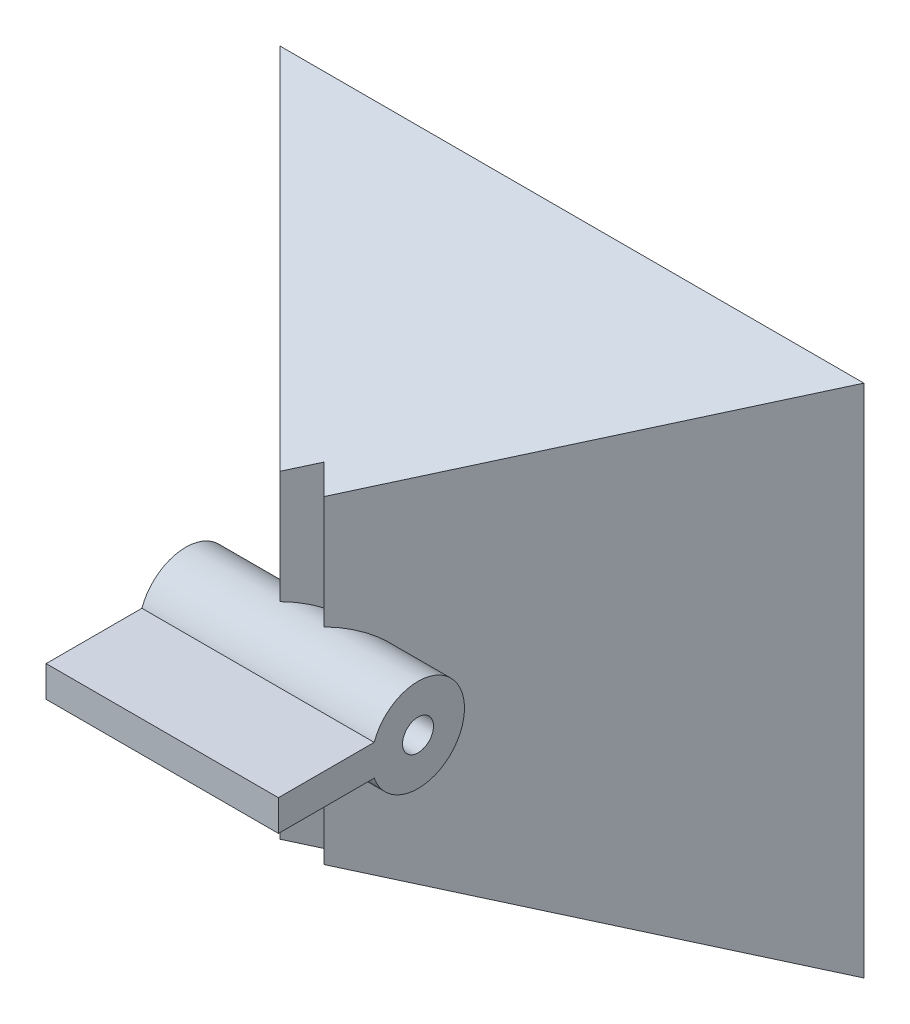
ISO-10303-21;
HEADER;
FILE_DESCRIPTION(('STEP AP214'),'2;1');
FILE_NAME('part.step','',(''),(''),'','','');
FILE_SCHEMA(('AUTOMOTIVE_DESIGN { 1 0 10303 214 1 1 1 1 }'));
ENDSEC;
DATA;
#1=APPLICATION_CONTEXT('core data for automotive mechanical design processes');
#2=APPLICATION_PROTOCOL_DEFINITION('international standard','automotive_design',2000,#1);
#3=PRODUCT_CONTEXT('',#1,'mechanical');
#4=PRODUCT('Part','Part','',(#3));
#5=PRODUCT_RELATED_PRODUCT_CATEGORY('part','',(#4));
#6=PRODUCT_DEFINITION_FORMATION('','',#4);
#7=PRODUCT_DEFINITION_CONTEXT('part definition',#1,'design');
#8=PRODUCT_DEFINITION('design','',#6,#7);
#9=PRODUCT_DEFINITION_SHAPE('','',#8);
#10=(LENGTH_UNIT() NAMED_UNIT(*) SI_UNIT(.MILLI.,.METRE.));
#11=(NAMED_UNIT(*) PLANE_ANGLE_UNIT() SI_UNIT($,.RADIAN.));
#12=(NAMED_UNIT(*) SI_UNIT($,.STERADIAN.) SOLID_ANGLE_UNIT());
#13=UNCERTAINTY_MEASURE_WITH_UNIT(LENGTH_MEASURE(1.E-05),#10,'distance_accuracy_value','');
#14=(GEOMETRIC_REPRESENTATION_CONTEXT(3) GLOBAL_UNCERTAINTY_ASSIGNED_CONTEXT((#13)) GLOBAL_UNIT_ASSIGNED_CONTEXT((#10,
#11,#12)) REPRESENTATION_CONTEXT('',''));
#15=CARTESIAN_POINT('',(0.,0.,0.));
#16=DIRECTION('',(0.,0.,1.));
#17=DIRECTION('',(1.,0.,0.));
#18=AXIS2_PLACEMENT_3D('',#15,#16,#17);
#19=CARTESIAN_POINT('',(2.12132034355969,200.,2.12132034355964));
#20=DIRECTION('',(-0.707106781186556,0.,-0.707106781186539));
#21=DIRECTION('',(-0.707106781186539,0.,0.707106781186556));
#22=AXIS2_PLACEMENT_3D('',#19,#20,#21);
#23=PLANE('',#22);
#24=DIRECTION('',(0.,-1.,0.));
#25=VECTOR('',#24,1.);
#26=CARTESIAN_POINT('',(28.2801311184706,200.,-24.0374904313519));
#27=LINE('',#26,#25);
#28=CARTESIAN_POINT('',(28.2801311184706,124.95160618677,-24.0374904313519));
#29=VERTEX_POINT('',#28);
#30=CARTESIAN_POINT('',(28.2801311184706,75.0483938132294,-24.0374904313519));
#31=VERTEX_POINT('',#30);
#32=EDGE_CURVE('E133',#29,#31,#27,.T.);
#33=ORIENTED_EDGE('',*,*,#32,.F.);
#34=DIRECTION('',(-0.684791078771728,-0.249243569363953,0.684791078771744));
#35=VECTOR('',#34,1.);
#36=CARTESIAN_POINT('',(16.5556101224632,120.684229533194,-12.3129694353442));
#37=LINE('',#36,#35);
#38=CARTESIAN_POINT('',(2.1213203435597,115.430577700901,2.12132034355965));
#39=VERTEX_POINT('',#38);
#40=EDGE_CURVE('E141',#29,#39,#37,.T.);
#41=ORIENTED_EDGE('',*,*,#40,.T.);
#42=DIRECTION('',(0.,-1.,0.));
#43=VECTOR('',#42,1.);
#44=CARTESIAN_POINT('',(2.12132034355969,200.,2.12132034355964));
#45=LINE('',#44,#43);
#46=CARTESIAN_POINT('',(2.12132034355969,104.500445072393,2.12132034355964));
#47=VERTEX_POINT('',#46);
#48=EDGE_CURVE('E173',#39,#47,#45,.T.);
#49=ORIENTED_EDGE('',*,*,#48,.T.);
#50=CARTESIAN_POINT('',(2.12132034355969,100.,2.12132034355964));
#51=DIRECTION('',(-0.707106781186556,0.,-0.707106781186539));
#52=DIRECTION('',(0.707106781186539,0.,-0.707106781186556));
#53=AXIS2_PLACEMENT_3D('',#50,#51,#52);
#54=ELLIPSE('',#53,6.36459045809348,4.50044507239315);
#55=CARTESIAN_POINT('',(2.12132034355969,95.4995549276068,2.12132034355964));
#56=VERTEX_POINT('',#55);
#57=EDGE_CURVE('E238',#47,#56,#54,.T.);
#58=ORIENTED_EDGE('',*,*,#57,.T.);
#59=CARTESIAN_POINT('',(2.12132034355969,84.5694222990992,2.12132034355964));
#60=VERTEX_POINT('',#59);
#61=EDGE_CURVE('E171',#56,#60,#45,.T.);
#62=ORIENTED_EDGE('',*,*,#61,.T.);
#63=DIRECTION('',(-0.684791078771727,0.249243569363957,0.684791078771744));
#64=VECTOR('',#63,1.);
#65=CARTESIAN_POINT('',(-17.5803444258686,91.7402418406624,21.8229851129884));
#66=LINE('',#65,#64);
#67=EDGE_CURVE('E144',#31,#60,#66,.T.);
#68=ORIENTED_EDGE('',*,*,#67,.F.);
#69=EDGE_LOOP('',(#33,#41,#49,#58,#62,#68));
#70=FACE_BOUND('',#69,.T.);
#71=ADVANCED_FACE('F34',(#70),#23,.F.);
#72=CARTESIAN_POINT('',(-2.12132034355964,200.,2.12132034355964));
#73=DIRECTION('',(0.707106781186548,0.,-0.707106781186548));
#74=DIRECTION('',(-0.707106781186548,0.,-0.707106781186548));
#75=AXIS2_PLACEMENT_3D('',#72,#73,#74);
#76=PLANE('',#75);
#77=DIRECTION('',(0.,1.,0.));
#78=VECTOR('',#77,1.);
#79=CARTESIAN_POINT('',(-28.2801311184712,200.,-24.0374904313519));
#80=LINE('',#79,#78);
#81=CARTESIAN_POINT('',(-28.2801311184712,75.0483938132294,-24.0374904313519));
#82=VERTEX_POINT('',#81);
#83=CARTESIAN_POINT('',(-28.2801311184712,124.95160618677,-24.0374904313519));
#84=VERTEX_POINT('',#83);
#85=EDGE_CURVE('E48',#82,#84,#80,.T.);
#86=ORIENTED_EDGE('',*,*,#85,.F.);
#87=DIRECTION('',(-0.684791078771736,-0.249243569363955,-0.684791078771736));
#88=VECTOR('',#87,1.);
#89=CARTESIAN_POINT('',(17.5803444258687,91.7402418406623,21.822985112988));
#90=LINE('',#89,#88);
#91=CARTESIAN_POINT('',(-2.12132034355964,84.5694222990993,2.12132034355964));
#92=VERTEX_POINT('',#91);
#93=EDGE_CURVE('E151',#92,#82,#90,.T.);
#94=ORIENTED_EDGE('',*,*,#93,.F.);
#95=DIRECTION('',(0.,-1.,0.));
#96=VECTOR('',#95,1.);
#97=CARTESIAN_POINT('',(-2.12132034355964,200.,2.12132034355964));
#98=LINE('',#97,#96);
#99=CARTESIAN_POINT('',(-2.12132034355964,95.4995549276069,2.12132034355964));
#100=VERTEX_POINT('',#99);
#101=EDGE_CURVE('E167',#100,#92,#98,.T.);
#102=ORIENTED_EDGE('',*,*,#101,.F.);
#103=CARTESIAN_POINT('',(-2.12132034355964,100.,2.12132034355964));
#104=DIRECTION('',(0.707106781186548,0.,-0.707106781186548));
#105=DIRECTION('',(0.707106781186548,0.,0.707106781186548));
#106=AXIS2_PLACEMENT_3D('',#103,#104,#105);
#107=ELLIPSE('',#106,6.36459045809356,4.50044507239315);
#108=CARTESIAN_POINT('',(-2.12132034355964,104.500445072393,2.12132034355964));
#109=VERTEX_POINT('',#108);
#110=EDGE_CURVE('E201',#100,#109,#107,.T.);
#111=ORIENTED_EDGE('',*,*,#110,.T.);
#112=CARTESIAN_POINT('',(-2.12132034355964,115.430577700901,2.12132034355964));
#113=VERTEX_POINT('',#112);
#114=EDGE_CURVE('E168',#113,#109,#98,.T.);
#115=ORIENTED_EDGE('',*,*,#114,.F.);
#116=DIRECTION('',(-0.684791078771737,0.24924356936395,-0.684791078771737));
#117=VECTOR('',#116,1.);
#118=CARTESIAN_POINT('',(-16.5556101224632,120.684229533194,-12.3129694353439));
#119=LINE('',#118,#117);
#120=EDGE_CURVE('E156',#113,#84,#119,.T.);
#121=ORIENTED_EDGE('',*,*,#120,.T.);
#122=EDGE_LOOP('',(#86,#94,#102,#111,#115,#121));
#123=FACE_BOUND('',#122,.T.);
#124=ADVANCED_FACE('F199',(#123),#76,.F.);
#125=CARTESIAN_POINT('',(-69.7611116446852,73.9948999380451,-26.9319410649545));
#126=DIRECTION('',(0.,-0.939692620785908,0.342020143325669));
#127=DIRECTION('',(0.,-0.342020143325669,-0.939692620785908));
#128=AXIS2_PLACEMENT_3D('',#125,#126,#127);
#129=PLANE('',#128);
#130=ORIENTED_EDGE('',*,*,#93,.T.);
#131=DIRECTION('',(1.,0.,0.));
#132=VECTOR('',#131,1.);
#133=CARTESIAN_POINT('',(-69.7611116446852,75.0483938132294,-24.0374904313519));
#134=LINE('',#133,#132);
#135=EDGE_CURVE('E145',#82,#31,#134,.T.);
#136=ORIENTED_EDGE('',*,*,#135,.T.);
#137=ORIENTED_EDGE('',*,*,#67,.T.);
#138=DIRECTION('',(-0.684791078771745,-0.249243569363952,-0.684791078771728));
#139=VECTOR('',#138,1.);
#140=CARTESIAN_POINT('',(19.833446188845,91.0161088923601,19.8334461888446));
#141=LINE('',#140,#139);
#142=CARTESIAN_POINT('',(0.,83.7973248367002,0.));
#143=VERTEX_POINT('',#142);
#144=EDGE_CURVE('E154',#60,#143,#141,.T.);
#145=ORIENTED_EDGE('',*,*,#144,.T.);
#146=DIRECTION('',(-0.684791078771736,0.249243569363955,0.684791078771736));
#147=VECTOR('',#146,1.);
#148=CARTESIAN_POINT('',(-19.833446188845,91.0161088923602,19.833446188845));
#149=LINE('',#148,#147);
#150=EDGE_CURVE('E179',#143,#92,#149,.T.);
#151=ORIENTED_EDGE('',*,*,#150,.T.);
#152=EDGE_LOOP('',(#130,#136,#137,#145,#151));
#153=FACE_BOUND('',#152,.T.);
#154=ADVANCED_FACE('F266',(#153),#129,.T.);
#155=CARTESIAN_POINT('',(-69.7611116446852,102.609544373853,37.3468199036989));
#156=DIRECTION('',(0.,-0.93969262078591,-0.342020143325664));
#157=DIRECTION('',(0.,0.342020143325664,-0.93969262078591));
#158=AXIS2_PLACEMENT_3D('',#155,#156,#157);
#159=PLANE('',#158);
#160=DIRECTION('',(1.,0.,0.));
#161=VECTOR('',#160,1.);
#162=CARTESIAN_POINT('',(-69.7611116446852,124.95160618677,-24.0374904313519));
#163=LINE('',#162,#161);
#164=EDGE_CURVE('E11',#84,#29,#163,.T.);
#165=ORIENTED_EDGE('',*,*,#164,.F.);
#166=ORIENTED_EDGE('',*,*,#120,.F.);
#167=DIRECTION('',(-0.684791078771737,-0.24924356936395,0.684791078771737));
#168=VECTOR('',#167,1.);
#169=CARTESIAN_POINT('',(14.3025083594869,121.408362481496,-14.3025083594869));
#170=LINE('',#169,#168);
#171=CARTESIAN_POINT('',(0.,116.2026751633,0.));
#172=VERTEX_POINT('',#171);
#173=EDGE_CURVE('E175',#172,#113,#170,.T.);
#174=ORIENTED_EDGE('',*,*,#173,.F.);
#175=DIRECTION('',(-0.684791078771745,0.249243569363947,-0.684791078771729));
#176=VECTOR('',#175,1.);
#177=CARTESIAN_POINT('',(-14.3025083594869,121.408362481496,-14.3025083594865));
#178=LINE('',#177,#176);
#179=EDGE_CURVE('E149',#39,#172,#178,.T.);
#180=ORIENTED_EDGE('',*,*,#179,.F.);
#181=ORIENTED_EDGE('',*,*,#40,.F.);
#182=EDGE_LOOP('',(#165,#166,#174,#180,#181));
#183=FACE_BOUND('',#182,.T.);
#184=ADVANCED_FACE('F147',(#183),#159,.F.);
#185=CARTESIAN_POINT('',(0.,200.,0.));
#186=DIRECTION('',(0.707106781186539,0.,-0.707106781186556));
#187=DIRECTION('',(-0.707106781186556,0.,-0.707106781186539));
#188=AXIS2_PLACEMENT_3D('',#185,#186,#187);
#189=PLANE('',#188);
#190=ORIENTED_EDGE('',*,*,#61,.F.);
#191=CARTESIAN_POINT('',(2.12132034355969,100.,2.12132034355964));
#192=DIRECTION('',(0.707106781186539,0.,-0.707106781186556));
#193=DIRECTION('',(0.707106781186556,0.,0.707106781186539));
#194=AXIS2_PLACEMENT_3D('',#191,#192,#193);
#195=ELLIPSE('',#194,6.36459045809363,4.50044507239315);
#196=CARTESIAN_POINT('',(0.,96.0308683758752,0.));
#197=VERTEX_POINT('',#196);
#198=EDGE_CURVE('E239',#56,#197,#195,.T.);
#199=ORIENTED_EDGE('',*,*,#198,.T.);
#200=DIRECTION('',(0.,-1.,0.));
#201=VECTOR('',#200,1.);
#202=CARTESIAN_POINT('',(0.,200.,0.));
#203=LINE('',#202,#201);
#204=EDGE_CURVE('E163',#197,#143,#203,.T.);
#205=ORIENTED_EDGE('',*,*,#204,.T.);
#206=ORIENTED_EDGE('',*,*,#144,.F.);
#207=EDGE_LOOP('',(#190,#199,#205,#206));
#208=FACE_BOUND('',#207,.T.);
#209=ADVANCED_FACE('F243',(#208),#189,.F.);
#210=CARTESIAN_POINT('',(0.,200.,0.));
#211=DIRECTION('',(-0.707106781186548,0.,-0.707106781186548));
#212=DIRECTION('',(-0.707106781186548,0.,0.707106781186548));
#213=AXIS2_PLACEMENT_3D('',#210,#211,#212);
#214=PLANE('',#213);
#215=ORIENTED_EDGE('',*,*,#204,.F.);
#216=CARTESIAN_POINT('',(-2.12132034355965,100.,2.12132034355964));
#217=DIRECTION('',(-0.707106781186548,0.,-0.707106781186548));
#218=DIRECTION('',(0.707106781186548,0.,-0.707106781186548));
#219=AXIS2_PLACEMENT_3D('',#216,#217,#218);
#220=ELLIPSE('',#219,6.36459045809356,4.50044507239315);
#221=EDGE_CURVE('E42',#197,#100,#220,.T.);
#222=ORIENTED_EDGE('',*,*,#221,.T.);
#223=ORIENTED_EDGE('',*,*,#101,.T.);
#224=ORIENTED_EDGE('',*,*,#150,.F.);
#225=EDGE_LOOP('',(#215,#222,#223,#224));
#226=FACE_BOUND('',#225,.T.);
#227=ADVANCED_FACE('F192',(#226),#214,.F.);
#228=CARTESIAN_POINT('',(0.,103.969131624125,0.));
#229=VERTEX_POINT('',#228);
#230=EDGE_CURVE('E164',#172,#229,#203,.T.);
#231=ORIENTED_EDGE('',*,*,#230,.T.);
#232=EDGE_CURVE('E235',#229,#47,#195,.T.);
#233=ORIENTED_EDGE('',*,*,#232,.T.);
#234=ORIENTED_EDGE('',*,*,#48,.F.);
#235=ORIENTED_EDGE('',*,*,#179,.T.);
#236=EDGE_LOOP('',(#231,#233,#234,#235));
#237=FACE_BOUND('',#236,.T.);
#238=ADVANCED_FACE('F36',(#237),#189,.F.);
#239=ORIENTED_EDGE('',*,*,#114,.T.);
#240=EDGE_CURVE('E184',#109,#229,#220,.T.);
#241=ORIENTED_EDGE('',*,*,#240,.T.);
#242=ORIENTED_EDGE('',*,*,#230,.F.);
#243=ORIENTED_EDGE('',*,*,#173,.T.);
#244=EDGE_LOOP('',(#239,#241,#242,#243));
#245=FACE_BOUND('',#244,.T.);
#246=ADVANCED_FACE('F246',(#245),#214,.F.);
#247=CARTESIAN_POINT('',(-11.25,100.,2.12132034355964));
#248=DIRECTION('',(1.,0.,0.));
#249=DIRECTION('',(0.,0.,-1.));
#250=AXIS2_PLACEMENT_3D('',#247,#248,#249);
#251=CYLINDRICAL_SURFACE('',#250,4.50044507239315);
#252=DIRECTION('',(1.,0.,0.));
#253=VECTOR('',#252,1.);
#254=CARTESIAN_POINT('',(-11.25,101.5,6.36443309832209));
#255=LINE('',#254,#253);
#256=CARTESIAN_POINT('',(-11.25,101.5,6.36443309832209));
#257=VERTEX_POINT('',#256);
#258=CARTESIAN_POINT('',(11.25,101.5,6.36443309832209));
#259=VERTEX_POINT('',#258);
#260=EDGE_CURVE('E467',#257,#259,#255,.T.);
#261=ORIENTED_EDGE('',*,*,#260,.T.);
#262=CARTESIAN_POINT('',(11.25,100.,2.12132034355964));
#263=DIRECTION('',(1.,0.,0.));
#264=DIRECTION('',(0.,0.,-1.));
#265=AXIS2_PLACEMENT_3D('',#262,#263,#264);
#266=CIRCLE('',#265,4.50044507239315);
#267=CARTESIAN_POINT('',(11.25,98.5,6.36443309832209));
#268=VERTEX_POINT('',#267);
#269=EDGE_CURVE('E440',#268,#259,#266,.T.);
#270=ORIENTED_EDGE('',*,*,#269,.F.);
#271=DIRECTION('',(1.,0.,0.));
#272=VECTOR('',#271,1.);
#273=CARTESIAN_POINT('',(-11.25,98.5,6.36443309832209));
#274=LINE('',#273,#272);
#275=CARTESIAN_POINT('',(-11.25,98.5,6.36443309832209));
#276=VERTEX_POINT('',#275);
#277=EDGE_CURVE('E211',#276,#268,#274,.T.);
#278=ORIENTED_EDGE('',*,*,#277,.F.);
#279=CARTESIAN_POINT('',(-11.25,100.,2.12132034355964));
#280=DIRECTION('',(1.,0.,0.));
#281=DIRECTION('',(0.,0.,-1.));
#282=AXIS2_PLACEMENT_3D('',#279,#280,#281);
#283=CIRCLE('',#282,4.50044507239315);
#284=EDGE_CURVE('E456',#276,#257,#283,.T.);
#285=ORIENTED_EDGE('',*,*,#284,.T.);
#286=EDGE_LOOP('',(#261,#270,#278,#285));
#287=FACE_BOUND('',#286,.T.);
#288=ORIENTED_EDGE('',*,*,#198,.F.);
#289=ORIENTED_EDGE('',*,*,#57,.F.);
#290=ORIENTED_EDGE('',*,*,#232,.F.);
#291=ORIENTED_EDGE('',*,*,#240,.F.);
#292=ORIENTED_EDGE('',*,*,#110,.F.);
#293=ORIENTED_EDGE('',*,*,#221,.F.);
#294=EDGE_LOOP('',(#288,#289,#290,#291,#292,#293));
#295=FACE_BOUND('',#294,.T.);
#296=ADVANCED_FACE('F217',(#287,#295),#251,.T.);
#297=CARTESIAN_POINT('',(-11.25,100.,2.12132034355964));
#298=DIRECTION('',(1.,0.,0.));
#299=DIRECTION('',(0.,0.,-1.));
#300=AXIS2_PLACEMENT_3D('',#297,#298,#299);
#301=CYLINDRICAL_SURFACE('',#300,1.5);
#302=CARTESIAN_POINT('',(-2.12132034355965,100.,2.12132034355964));
#303=DIRECTION('',(-0.707106781186548,0.,-0.707106781186548));
#304=DIRECTION('',(0.707106781186548,0.,-0.707106781186548));
#305=AXIS2_PLACEMENT_3D('',#302,#303,#304);
#306=ELLIPSE('',#305,2.12132034355964,1.5);
#307=CARTESIAN_POINT('',(-2.12132034355964,101.5,2.12132034355964));
#308=VERTEX_POINT('',#307);
#309=CARTESIAN_POINT('',(-2.12132034355964,98.5,2.12132034355964));
#310=VERTEX_POINT('',#309);
#311=EDGE_CURVE('E182',#308,#310,#306,.T.);
#312=ORIENTED_EDGE('',*,*,#311,.T.);
#313=CARTESIAN_POINT('',(-2.12132034355964,100.,2.12132034355964));
#314=DIRECTION('',(0.707106781186548,0.,-0.707106781186548));
#315=DIRECTION('',(0.707106781186548,0.,0.707106781186548));
#316=AXIS2_PLACEMENT_3D('',#313,#314,#315);
#317=ELLIPSE('',#316,2.12132034355964,1.5);
#318=EDGE_CURVE('E208',#310,#308,#317,.T.);
#319=ORIENTED_EDGE('',*,*,#318,.T.);
#320=EDGE_LOOP('',(#312,#319));
#321=FACE_BOUND('',#320,.T.);
#322=CARTESIAN_POINT('',(-11.25,100.,2.12132034355964));
#323=DIRECTION('',(1.,0.,0.));
#324=DIRECTION('',(0.,0.,-1.));
#325=AXIS2_PLACEMENT_3D('',#322,#323,#324);
#326=CIRCLE('',#325,1.5);
#327=CARTESIAN_POINT('',(-11.25,100.,0.621320343559643));
#328=VERTEX_POINT('',#327);
#329=EDGE_CURVE('E222',#328,#328,#326,.T.);
#330=ORIENTED_EDGE('',*,*,#329,.F.);
#331=EDGE_LOOP('',(#330));
#332=FACE_BOUND('',#331,.T.);
#333=CARTESIAN_POINT('',(11.25,100.,2.12132034355964));
#334=DIRECTION('',(1.,0.,0.));
#335=DIRECTION('',(0.,0.,-1.));
#336=AXIS2_PLACEMENT_3D('',#333,#334,#335);
#337=CIRCLE('',#336,1.5);
#338=CARTESIAN_POINT('',(11.25,100.,0.621320343559643));
#339=VERTEX_POINT('',#338);
#340=EDGE_CURVE('E226',#339,#339,#337,.T.);
#341=ORIENTED_EDGE('',*,*,#340,.T.);
#342=EDGE_LOOP('',(#341));
#343=FACE_BOUND('',#342,.T.);
#344=CARTESIAN_POINT('',(2.12132034355969,100.,2.12132034355964));
#345=DIRECTION('',(-0.707106781186556,0.,-0.707106781186539));
#346=DIRECTION('',(0.707106781186539,0.,-0.707106781186556));
#347=AXIS2_PLACEMENT_3D('',#344,#345,#346);
#348=ELLIPSE('',#347,2.12132034355962,1.5);
#349=CARTESIAN_POINT('',(2.12132034355969,101.5,2.12132034355964));
#350=VERTEX_POINT('',#349);
#351=CARTESIAN_POINT('',(2.12132034355969,98.5,2.12132034355964));
#352=VERTEX_POINT('',#351);
#353=EDGE_CURVE('E55',#350,#352,#348,.T.);
#354=ORIENTED_EDGE('',*,*,#353,.T.);
#355=CARTESIAN_POINT('',(2.12132034355969,100.,2.12132034355964));
#356=DIRECTION('',(0.707106781186539,0.,-0.707106781186556));
#357=DIRECTION('',(0.707106781186556,0.,0.707106781186539));
#358=AXIS2_PLACEMENT_3D('',#355,#356,#357);
#359=ELLIPSE('',#358,2.12132034355967,1.5);
#360=EDGE_CURVE('E229',#352,#350,#359,.T.);
#361=ORIENTED_EDGE('',*,*,#360,.T.);
#362=EDGE_LOOP('',(#354,#361));
#363=FACE_BOUND('',#362,.T.);
#364=ADVANCED_FACE('F213',(#321,#332,#343,#363),#301,.F.);
#365=CARTESIAN_POINT('',(-11.25,98.5,0.));
#366=DIRECTION('',(0.,1.,0.));
#367=DIRECTION('',(0.,0.,1.));
#368=AXIS2_PLACEMENT_3D('',#365,#366,#367);
#369=PLANE('',#368);
#370=ORIENTED_EDGE('',*,*,#277,.T.);
#371=DIRECTION('',(0.,0.,1.));
#372=VECTOR('',#371,1.);
#373=CARTESIAN_POINT('',(11.25,98.5,0.));
#374=LINE('',#373,#372);
#375=CARTESIAN_POINT('',(11.25,98.5,15.6439692806303));
#376=VERTEX_POINT('',#375);
#377=EDGE_CURVE('E452',#268,#376,#374,.T.);
#378=ORIENTED_EDGE('',*,*,#377,.T.);
#379=DIRECTION('',(1.,0.,0.));
#380=VECTOR('',#379,1.);
#381=CARTESIAN_POINT('',(-11.25,98.5,15.6439692806303));
#382=LINE('',#381,#380);
#383=CARTESIAN_POINT('',(-11.25,98.5,15.6439692806303));
#384=VERTEX_POINT('',#383);
#385=EDGE_CURVE('E469',#384,#376,#382,.T.);
#386=ORIENTED_EDGE('',*,*,#385,.F.);
#387=DIRECTION('',(0.,0.,1.));
#388=VECTOR('',#387,1.);
#389=CARTESIAN_POINT('',(-11.25,98.5,0.));
#390=LINE('',#389,#388);
#391=EDGE_CURVE('E464',#276,#384,#390,.T.);
#392=ORIENTED_EDGE('',*,*,#391,.F.);
#393=EDGE_LOOP('',(#370,#378,#386,#392));
#394=FACE_BOUND('',#393,.T.);
#395=ADVANCED_FACE('F216',(#394),#369,.F.);
#396=CARTESIAN_POINT('',(-11.25,0.,15.6439692806303));
#397=DIRECTION('',(0.,0.,-1.));
#398=DIRECTION('',(-1.,0.,0.));
#399=AXIS2_PLACEMENT_3D('',#396,#397,#398);
#400=PLANE('',#399);
#401=ORIENTED_EDGE('',*,*,#385,.T.);
#402=DIRECTION('',(0.,1.,0.));
#403=VECTOR('',#402,1.);
#404=CARTESIAN_POINT('',(11.25,0.,15.6439692806303));
#405=LINE('',#404,#403);
#406=CARTESIAN_POINT('',(11.25,101.5,15.6439692806303));
#407=VERTEX_POINT('',#406);
#408=EDGE_CURVE('E449',#376,#407,#405,.T.);
#409=ORIENTED_EDGE('',*,*,#408,.T.);
#410=DIRECTION('',(1.,0.,0.));
#411=VECTOR('',#410,1.);
#412=CARTESIAN_POINT('',(-11.25,101.5,15.6439692806303));
#413=LINE('',#412,#411);
#414=CARTESIAN_POINT('',(-11.25,101.5,15.6439692806303));
#415=VERTEX_POINT('',#414);
#416=EDGE_CURVE('E471',#415,#407,#413,.T.);
#417=ORIENTED_EDGE('',*,*,#416,.F.);
#418=DIRECTION('',(0.,1.,0.));
#419=VECTOR('',#418,1.);
#420=CARTESIAN_POINT('',(-11.25,0.,15.6439692806303));
#421=LINE('',#420,#419);
#422=EDGE_CURVE('E462',#384,#415,#421,.T.);
#423=ORIENTED_EDGE('',*,*,#422,.F.);
#424=EDGE_LOOP('',(#401,#409,#417,#423));
#425=FACE_BOUND('',#424,.T.);
#426=ADVANCED_FACE('F301',(#425),#400,.F.);
#427=CARTESIAN_POINT('',(-11.25,101.5,0.));
#428=DIRECTION('',(0.,1.,0.));
#429=DIRECTION('',(0.,0.,1.));
#430=AXIS2_PLACEMENT_3D('',#427,#428,#429);
#431=PLANE('',#430);
#432=ORIENTED_EDGE('',*,*,#416,.T.);
#433=DIRECTION('',(0.,0.,1.));
#434=VECTOR('',#433,1.);
#435=CARTESIAN_POINT('',(11.25,101.5,0.));
#436=LINE('',#435,#434);
#437=EDGE_CURVE('E443',#259,#407,#436,.T.);
#438=ORIENTED_EDGE('',*,*,#437,.F.);
#439=ORIENTED_EDGE('',*,*,#260,.F.);
#440=DIRECTION('',(0.,0.,1.));
#441=VECTOR('',#440,1.);
#442=CARTESIAN_POINT('',(-11.25,101.5,0.));
#443=LINE('',#442,#441);
#444=EDGE_CURVE('E459',#257,#415,#443,.T.);
#445=ORIENTED_EDGE('',*,*,#444,.T.);
#446=EDGE_LOOP('',(#432,#438,#439,#445));
#447=FACE_BOUND('',#446,.T.);
#448=ADVANCED_FACE('F293',(#447),#431,.T.);
#449=CARTESIAN_POINT('',(-11.25,0.,0.));
#450=DIRECTION('',(1.,0.,0.));
#451=DIRECTION('',(0.,0.,-1.));
#452=AXIS2_PLACEMENT_3D('',#449,#450,#451);
#453=PLANE('',#452);
#454=ORIENTED_EDGE('',*,*,#284,.F.);
#455=ORIENTED_EDGE('',*,*,#391,.T.);
#456=ORIENTED_EDGE('',*,*,#422,.T.);
#457=ORIENTED_EDGE('',*,*,#444,.F.);
#458=EDGE_LOOP('',(#454,#455,#456,#457));
#459=FACE_BOUND('',#458,.T.);
#460=ORIENTED_EDGE('',*,*,#329,.T.);
#461=EDGE_LOOP('',(#460));
#462=FACE_BOUND('',#461,.T.);
#463=ADVANCED_FACE('F285',(#459,#462),#453,.F.);
#464=CARTESIAN_POINT('',(11.25,0.,0.));
#465=DIRECTION('',(1.,0.,0.));
#466=DIRECTION('',(0.,0.,-1.));
#467=AXIS2_PLACEMENT_3D('',#464,#465,#466);
#468=PLANE('',#467);
#469=ORIENTED_EDGE('',*,*,#269,.T.);
#470=ORIENTED_EDGE('',*,*,#437,.T.);
#471=ORIENTED_EDGE('',*,*,#408,.F.);
#472=ORIENTED_EDGE('',*,*,#377,.F.);
#473=EDGE_LOOP('',(#469,#470,#471,#472));
#474=FACE_BOUND('',#473,.T.);
#475=ORIENTED_EDGE('',*,*,#340,.F.);
#476=EDGE_LOOP('',(#475));
#477=FACE_BOUND('',#476,.T.);
#478=ADVANCED_FACE('F260',(#474,#477),#468,.T.);
#479=ORIENTED_EDGE('',*,*,#311,.F.);
#480=EDGE_CURVE('E172',#308,#310,#98,.T.);
#481=ORIENTED_EDGE('',*,*,#480,.T.);
#482=EDGE_LOOP('',(#479,#481));
#483=FACE_BOUND('',#482,.T.);
#484=ADVANCED_FACE('F205',(#483),#214,.F.);
#485=ORIENTED_EDGE('',*,*,#318,.F.);
#486=ORIENTED_EDGE('',*,*,#480,.F.);
#487=EDGE_LOOP('',(#485,#486));
#488=FACE_BOUND('',#487,.T.);
#489=ADVANCED_FACE('F209',(#488),#76,.F.);
#490=ORIENTED_EDGE('',*,*,#353,.F.);
#491=EDGE_CURVE('E176',#350,#352,#45,.T.);
#492=ORIENTED_EDGE('',*,*,#491,.T.);
#493=EDGE_LOOP('',(#490,#492));
#494=FACE_BOUND('',#493,.T.);
#495=ADVANCED_FACE('F262',(#494),#23,.F.);
#496=ORIENTED_EDGE('',*,*,#360,.F.);
#497=ORIENTED_EDGE('',*,*,#491,.F.);
#498=EDGE_LOOP('',(#496,#497));
#499=FACE_BOUND('',#498,.T.);
#500=ADVANCED_FACE('F255',(#499),#189,.F.);
#501=CARTESIAN_POINT('',(0.,73.8926174307382,-24.0374904313519));
#502=DIRECTION('',(0.,0.,-1.));
#503=DIRECTION('',(-1.,0.,0.));
#504=AXIS2_PLACEMENT_3D('',#501,#502,#503);
#505=PLANE('',#504);
#506=ORIENTED_EDGE('',*,*,#85,.T.);
#507=ORIENTED_EDGE('',*,*,#164,.T.);
#508=ORIENTED_EDGE('',*,*,#32,.T.);
#509=ORIENTED_EDGE('',*,*,#135,.F.);
#510=EDGE_LOOP('',(#506,#507,#508,#509));
#511=FACE_BOUND('',#510,.T.);
#512=ADVANCED_FACE('F132',(#511),#505,.T.);
#513=CLOSED_SHELL('',(#71,#124,#154,#184,#209,#227,#238,#246,#296,#364,#395,#426,#448,#463,#478,
#484,#489,#495,#500,#512));
#514=MANIFOLD_SOLID_BREP('B2',#513);
#515=ADVANCED_BREP_SHAPE_REPRESENTATION('',(#18,#514),#14);
#516=SHAPE_DEFINITION_REPRESENTATION(#9,#515);
ENDSEC;
END-ISO-10303-21;
